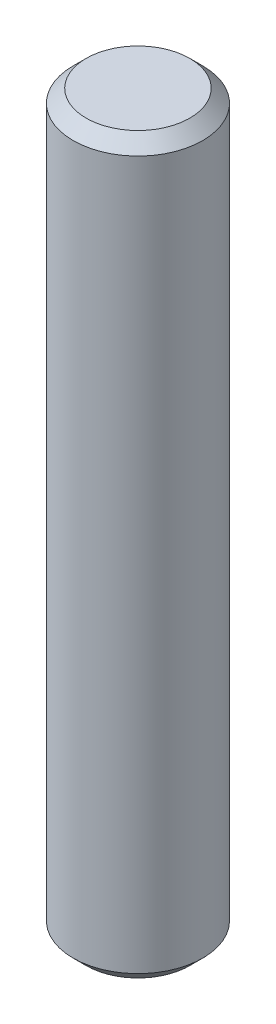
ISO-10303-21;
HEADER;
FILE_DESCRIPTION(('STEP AP214'),'2;1');
FILE_NAME('part.step','',(''),(''),'','','');
FILE_SCHEMA(('AUTOMOTIVE_DESIGN { 1 0 10303 214 1 1 1 1 }'));
ENDSEC;
DATA;
#1=APPLICATION_CONTEXT('core data for automotive mechanical design processes');
#2=APPLICATION_PROTOCOL_DEFINITION('international standard','automotive_design',2000,#1);
#3=PRODUCT_CONTEXT('',#1,'mechanical');
#4=PRODUCT('Part','Part','',(#3));
#5=PRODUCT_RELATED_PRODUCT_CATEGORY('part','',(#4));
#6=PRODUCT_DEFINITION_FORMATION('','',#4);
#7=PRODUCT_DEFINITION_CONTEXT('part definition',#1,'design');
#8=PRODUCT_DEFINITION('design','',#6,#7);
#9=PRODUCT_DEFINITION_SHAPE('','',#8);
#10=(LENGTH_UNIT() NAMED_UNIT(*) SI_UNIT(.MILLI.,.METRE.));
#11=(NAMED_UNIT(*) PLANE_ANGLE_UNIT() SI_UNIT($,.RADIAN.));
#12=(NAMED_UNIT(*) SI_UNIT($,.STERADIAN.) SOLID_ANGLE_UNIT());
#13=UNCERTAINTY_MEASURE_WITH_UNIT(LENGTH_MEASURE(1.E-05),#10,'distance_accuracy_value','');
#14=(GEOMETRIC_REPRESENTATION_CONTEXT(3) GLOBAL_UNCERTAINTY_ASSIGNED_CONTEXT((#13)) GLOBAL_UNIT_ASSIGNED_CONTEXT((#10,
#11,#12)) REPRESENTATION_CONTEXT('',''));
#15=CARTESIAN_POINT('',(0.,0.,0.));
#16=DIRECTION('',(0.,0.,1.));
#17=DIRECTION('',(1.,0.,0.));
#18=AXIS2_PLACEMENT_3D('',#15,#16,#17);
#19=CARTESIAN_POINT('',(0.,0.,0.));
#20=DIRECTION('',(0.,1.,0.));
#21=DIRECTION('',(0.,0.,1.));
#22=AXIS2_PLACEMENT_3D('',#19,#20,#21);
#23=PLANE('',#22);
#24=CARTESIAN_POINT('',(0.,0.,0.));
#25=DIRECTION('',(0.,1.,0.));
#26=DIRECTION('',(0.,0.,1.));
#27=AXIS2_PLACEMENT_3D('',#24,#25,#26);
#28=CIRCLE('',#27,1.20000000003984);
#29=CARTESIAN_POINT('',(0.,0.,1.20000000003984));
#30=VERTEX_POINT('',#29);
#31=EDGE_CURVE('E17',#30,#30,#28,.T.);
#32=ORIENTED_EDGE('',*,*,#31,.F.);
#33=EDGE_LOOP('',(#32));
#34=FACE_BOUND('',#33,.T.);
#35=ADVANCED_FACE('F14',(#34),#23,.F.);
#36=CARTESIAN_POINT('',(0.,17.,0.));
#37=DIRECTION('',(0.,1.,0.));
#38=DIRECTION('',(0.,0.,1.));
#39=AXIS2_PLACEMENT_3D('',#36,#37,#38);
#40=PLANE('',#39);
#41=CARTESIAN_POINT('',(0.,17.0000000000528,0.));
#42=DIRECTION('',(0.,-1.,0.));
#43=DIRECTION('',(0.,0.,-1.));
#44=AXIS2_PLACEMENT_3D('',#41,#42,#43);
#45=CIRCLE('',#44,1.19999999998299);
#46=CARTESIAN_POINT('',(0.,17.0000000000528,-1.19999999998299));
#47=VERTEX_POINT('',#46);
#48=EDGE_CURVE('E26',#47,#47,#45,.T.);
#49=ORIENTED_EDGE('',*,*,#48,.F.);
#50=EDGE_LOOP('',(#49));
#51=FACE_BOUND('',#50,.T.);
#52=ADVANCED_FACE('F37',(#51),#40,.T.);
#53=CARTESIAN_POINT('',(0.,0.299999999981537,0.));
#54=DIRECTION('',(0.,1.,0.));
#55=DIRECTION('',(0.,0.,1.));
#56=AXIS2_PLACEMENT_3D('',#53,#54,#55);
#57=CONICAL_SURFACE('',#56,1.50000000002137,0.785398163397448);
#58=CARTESIAN_POINT('',(0.,0.3,0.));
#59=DIRECTION('',(0.,1.,0.));
#60=DIRECTION('',(0.,0.,1.));
#61=AXIS2_PLACEMENT_3D('',#58,#59,#60);
#62=CIRCLE('',#61,1.5);
#63=CARTESIAN_POINT('',(0.,0.3,1.5));
#64=VERTEX_POINT('',#63);
#65=EDGE_CURVE('E21',#64,#64,#62,.T.);
#66=ORIENTED_EDGE('',*,*,#65,.F.);
#67=EDGE_LOOP('',(#66));
#68=FACE_BOUND('',#67,.T.);
#69=ORIENTED_EDGE('',*,*,#31,.T.);
#70=EDGE_LOOP('',(#69));
#71=FACE_BOUND('',#70,.T.);
#72=ADVANCED_FACE('F34',(#68,#71),#57,.T.);
#73=CARTESIAN_POINT('',(0.,16.7000000000144,0.));
#74=DIRECTION('',(0.,-1.,0.));
#75=DIRECTION('',(0.,0.,-1.));
#76=AXIS2_PLACEMENT_3D('',#73,#74,#75);
#77=CONICAL_SURFACE('',#76,1.50000000002137,0.785398163397448);
#78=CARTESIAN_POINT('',(0.,16.7,0.));
#79=DIRECTION('',(0.,1.,0.));
#80=DIRECTION('',(0.,0.,1.));
#81=AXIS2_PLACEMENT_3D('',#78,#79,#80);
#82=CIRCLE('',#81,1.5);
#83=CARTESIAN_POINT('',(0.,16.7,1.5));
#84=VERTEX_POINT('',#83);
#85=EDGE_CURVE('E10',#84,#84,#82,.F.);
#86=ORIENTED_EDGE('',*,*,#85,.F.);
#87=EDGE_LOOP('',(#86));
#88=FACE_BOUND('',#87,.T.);
#89=ORIENTED_EDGE('',*,*,#48,.T.);
#90=EDGE_LOOP('',(#89));
#91=FACE_BOUND('',#90,.T.);
#92=ADVANCED_FACE('F45',(#88,#91),#77,.T.);
#93=CARTESIAN_POINT('',(0.,0.,0.));
#94=DIRECTION('',(0.,1.,0.));
#95=DIRECTION('',(0.,0.,1.));
#96=AXIS2_PLACEMENT_3D('',#93,#94,#95);
#97=CYLINDRICAL_SURFACE('',#96,1.5);
#98=ORIENTED_EDGE('',*,*,#65,.T.);
#99=EDGE_LOOP('',(#98));
#100=FACE_BOUND('',#99,.T.);
#101=ORIENTED_EDGE('',*,*,#85,.T.);
#102=EDGE_LOOP('',(#101));
#103=FACE_BOUND('',#102,.T.);
#104=ADVANCED_FACE('F43',(#100,#103),#97,.T.);
#105=CLOSED_SHELL('',(#35,#52,#72,#92,#104));
#106=MANIFOLD_SOLID_BREP('B1',#105);
#107=ADVANCED_BREP_SHAPE_REPRESENTATION('',(#18,#106),#14);
#108=SHAPE_DEFINITION_REPRESENTATION(#9,#107);
ENDSEC;
END-ISO-10303-21;
